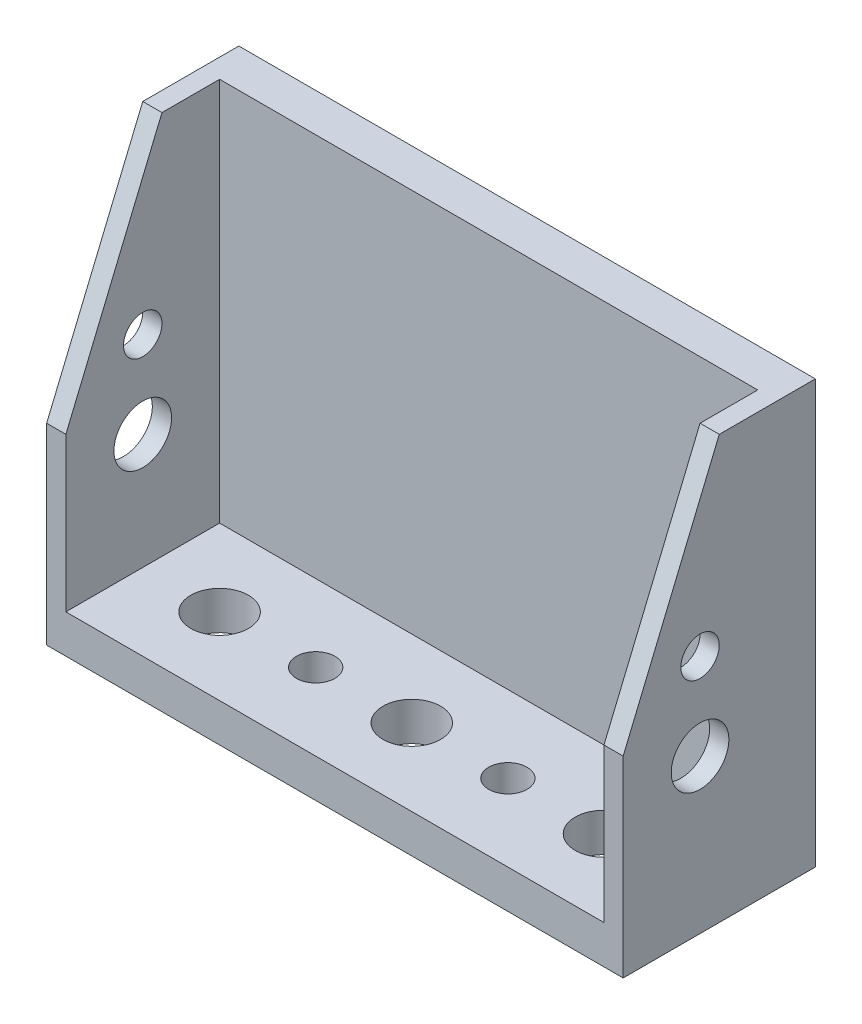
ISO-10303-21;
HEADER;
FILE_DESCRIPTION(('STEP AP214'),'2;1');
FILE_NAME('part.step','',(''),(''),'','','');
FILE_SCHEMA(('AUTOMOTIVE_DESIGN { 1 0 10303 214 1 1 1 1 }'));
ENDSEC;
DATA;
#1=APPLICATION_CONTEXT('core data for automotive mechanical design processes');
#2=APPLICATION_PROTOCOL_DEFINITION('international standard','automotive_design',2000,#1);
#3=PRODUCT_CONTEXT('',#1,'mechanical');
#4=PRODUCT('Part','Part','',(#3));
#5=PRODUCT_RELATED_PRODUCT_CATEGORY('part','',(#4));
#6=PRODUCT_DEFINITION_FORMATION('','',#4);
#7=PRODUCT_DEFINITION_CONTEXT('part definition',#1,'design');
#8=PRODUCT_DEFINITION('design','',#6,#7);
#9=PRODUCT_DEFINITION_SHAPE('','',#8);
#10=(LENGTH_UNIT() NAMED_UNIT(*) SI_UNIT(.MILLI.,.METRE.));
#11=(NAMED_UNIT(*) PLANE_ANGLE_UNIT() SI_UNIT($,.RADIAN.));
#12=(NAMED_UNIT(*) SI_UNIT($,.STERADIAN.) SOLID_ANGLE_UNIT());
#13=UNCERTAINTY_MEASURE_WITH_UNIT(LENGTH_MEASURE(1.E-05),#10,'distance_accuracy_value','');
#14=(GEOMETRIC_REPRESENTATION_CONTEXT(3) GLOBAL_UNCERTAINTY_ASSIGNED_CONTEXT((#13)) GLOBAL_UNIT_ASSIGNED_CONTEXT((#10,
#11,#12)) REPRESENTATION_CONTEXT('',''));
#15=CARTESIAN_POINT('',(0.,0.,0.));
#16=DIRECTION('',(0.,0.,1.));
#17=DIRECTION('',(1.,0.,0.));
#18=AXIS2_PLACEMENT_3D('',#15,#16,#17);
#19=CARTESIAN_POINT('',(0.,2.,0.));
#20=DIRECTION('',(0.,-1.,0.));
#21=DIRECTION('',(0.,0.,-1.));
#22=AXIS2_PLACEMENT_3D('',#19,#20,#21);
#23=PLANE('',#22);
#24=CARTESIAN_POINT('',(5.,2.,0.999999999999999));
#25=DIRECTION('',(0.,-1.,0.));
#26=DIRECTION('',(0.,0.,-1.));
#27=AXIS2_PLACEMENT_3D('',#24,#25,#26);
#28=CIRCLE('',#27,1.);
#29=CARTESIAN_POINT('',(5.,2.,0.));
#30=VERTEX_POINT('',#29);
#31=EDGE_CURVE('E246',#30,#30,#28,.T.);
#32=ORIENTED_EDGE('',*,*,#31,.T.);
#33=EDGE_LOOP('',(#32));
#34=FACE_BOUND('',#33,.T.);
#35=CARTESIAN_POINT('',(-5.,2.,0.999999999999999));
#36=DIRECTION('',(0.,-1.,0.));
#37=DIRECTION('',(0.,0.,-1.));
#38=AXIS2_PLACEMENT_3D('',#35,#36,#37);
#39=CIRCLE('',#38,1.);
#40=CARTESIAN_POINT('',(-5.,2.,0.));
#41=VERTEX_POINT('',#40);
#42=EDGE_CURVE('E243',#41,#41,#39,.T.);
#43=ORIENTED_EDGE('',*,*,#42,.T.);
#44=EDGE_LOOP('',(#43));
#45=FACE_BOUND('',#44,.T.);
#46=CARTESIAN_POINT('',(10.,2.,0.999999999999999));
#47=DIRECTION('',(0.,-1.,0.));
#48=DIRECTION('',(0.,0.,-1.));
#49=AXIS2_PLACEMENT_3D('',#46,#47,#48);
#50=CIRCLE('',#49,1.5);
#51=CARTESIAN_POINT('',(10.,2.,-0.5));
#52=VERTEX_POINT('',#51);
#53=EDGE_CURVE('E240',#52,#52,#50,.T.);
#54=ORIENTED_EDGE('',*,*,#53,.T.);
#55=EDGE_LOOP('',(#54));
#56=FACE_BOUND('',#55,.T.);
#57=CARTESIAN_POINT('',(-10.,2.,0.999999999999999));
#58=DIRECTION('',(0.,-1.,0.));
#59=DIRECTION('',(0.,0.,-1.));
#60=AXIS2_PLACEMENT_3D('',#57,#58,#59);
#61=CIRCLE('',#60,1.5);
#62=CARTESIAN_POINT('',(-10.,2.,-0.5));
#63=VERTEX_POINT('',#62);
#64=EDGE_CURVE('E237',#63,#63,#61,.T.);
#65=ORIENTED_EDGE('',*,*,#64,.T.);
#66=EDGE_LOOP('',(#65));
#67=FACE_BOUND('',#66,.T.);
#68=CARTESIAN_POINT('',(0.,2.,0.999999999999999));
#69=DIRECTION('',(0.,-1.,0.));
#70=DIRECTION('',(0.,0.,-1.));
#71=AXIS2_PLACEMENT_3D('',#68,#69,#70);
#72=CIRCLE('',#71,1.5);
#73=CARTESIAN_POINT('',(0.,2.,-0.500000000000001));
#74=VERTEX_POINT('',#73);
#75=EDGE_CURVE('E234',#74,#74,#72,.T.);
#76=ORIENTED_EDGE('',*,*,#75,.T.);
#77=EDGE_LOOP('',(#76));
#78=FACE_BOUND('',#77,.T.);
#79=DIRECTION('',(1.,0.,0.));
#80=VECTOR('',#79,1.);
#81=CARTESIAN_POINT('',(-15.,2.,-3.));
#82=LINE('',#81,#80);
#83=CARTESIAN_POINT('',(-14.,2.,-3.));
#84=VERTEX_POINT('',#83);
#85=CARTESIAN_POINT('',(14.,2.,-3.));
#86=VERTEX_POINT('',#85);
#87=EDGE_CURVE('E166',#84,#86,#82,.T.);
#88=ORIENTED_EDGE('',*,*,#87,.F.);
#89=DIRECTION('',(0.,0.,-1.));
#90=VECTOR('',#89,1.);
#91=CARTESIAN_POINT('',(-14.,2.,5.));
#92=LINE('',#91,#90);
#93=CARTESIAN_POINT('',(-14.,2.,5.));
#94=VERTEX_POINT('',#93);
#95=EDGE_CURVE('E129',#94,#84,#92,.T.);
#96=ORIENTED_EDGE('',*,*,#95,.F.);
#97=DIRECTION('',(1.,0.,0.));
#98=VECTOR('',#97,1.);
#99=CARTESIAN_POINT('',(-15.,2.,5.));
#100=LINE('',#99,#98);
#101=CARTESIAN_POINT('',(14.,2.,5.));
#102=VERTEX_POINT('',#101);
#103=EDGE_CURVE('E126',#94,#102,#100,.T.);
#104=ORIENTED_EDGE('',*,*,#103,.T.);
#105=DIRECTION('',(0.,0.,-1.));
#106=VECTOR('',#105,1.);
#107=CARTESIAN_POINT('',(14.,2.,-3.));
#108=LINE('',#107,#106);
#109=EDGE_CURVE('E144',#102,#86,#108,.T.);
#110=ORIENTED_EDGE('',*,*,#109,.T.);
#111=EDGE_LOOP('',(#88,#96,#104,#110));
#112=FACE_BOUND('',#111,.T.);
#113=ADVANCED_FACE('F40',(#34,#45,#56,#67,#78,#112),#23,.F.);
#114=CARTESIAN_POINT('',(15.,2.,5.));
#115=DIRECTION('',(-1.,0.,0.));
#116=DIRECTION('',(0.,0.,1.));
#117=AXIS2_PLACEMENT_3D('',#114,#115,#116);
#118=PLANE('',#117);
#119=CARTESIAN_POINT('',(15.,8.,0.999999999999999));
#120=DIRECTION('',(1.,0.,0.));
#121=DIRECTION('',(0.,0.,-1.));
#122=AXIS2_PLACEMENT_3D('',#119,#120,#121);
#123=CIRCLE('',#122,1.5);
#124=CARTESIAN_POINT('',(15.,8.,-0.500000000000001));
#125=VERTEX_POINT('',#124);
#126=EDGE_CURVE('E197',#125,#125,#123,.T.);
#127=ORIENTED_EDGE('',*,*,#126,.F.);
#128=EDGE_LOOP('',(#127));
#129=FACE_BOUND('',#128,.T.);
#130=CARTESIAN_POINT('',(15.,12.5,0.999999999999999));
#131=DIRECTION('',(1.,0.,0.));
#132=DIRECTION('',(0.,0.,-1.));
#133=AXIS2_PLACEMENT_3D('',#130,#131,#132);
#134=CIRCLE('',#133,1.);
#135=CARTESIAN_POINT('',(15.,12.5,0.));
#136=VERTEX_POINT('',#135);
#137=EDGE_CURVE('E204',#136,#136,#134,.T.);
#138=ORIENTED_EDGE('',*,*,#137,.F.);
#139=EDGE_LOOP('',(#138));
#140=FACE_BOUND('',#139,.T.);
#141=DIRECTION('',(0.,0.,-1.));
#142=VECTOR('',#141,1.);
#143=CARTESIAN_POINT('',(15.,0.,5.));
#144=LINE('',#143,#142);
#145=CARTESIAN_POINT('',(15.,0.,5.));
#146=VERTEX_POINT('',#145);
#147=CARTESIAN_POINT('',(15.,0.,-5.));
#148=VERTEX_POINT('',#147);
#149=EDGE_CURVE('E179',#146,#148,#144,.T.);
#150=ORIENTED_EDGE('',*,*,#149,.T.);
#151=DIRECTION('',(0.,-1.,0.));
#152=VECTOR('',#151,1.);
#153=CARTESIAN_POINT('',(15.,2.,-5.));
#154=LINE('',#153,#152);
#155=CARTESIAN_POINT('',(15.,22.,-5.));
#156=VERTEX_POINT('',#155);
#157=EDGE_CURVE('E11',#156,#148,#154,.T.);
#158=ORIENTED_EDGE('',*,*,#157,.F.);
#159=DIRECTION('',(0.,0.,-1.));
#160=VECTOR('',#159,1.);
#161=CARTESIAN_POINT('',(15.,22.,-5.));
#162=LINE('',#161,#160);
#163=CARTESIAN_POINT('',(15.,22.,0.));
#164=VERTEX_POINT('',#163);
#165=EDGE_CURVE('E173',#164,#156,#162,.T.);
#166=ORIENTED_EDGE('',*,*,#165,.F.);
#167=DIRECTION('',(0.,-0.923076923076923,0.384615384615385));
#168=VECTOR('',#167,1.);
#169=CARTESIAN_POINT('',(15.,10.,5.));
#170=LINE('',#169,#168);
#171=CARTESIAN_POINT('',(15.,10.,5.));
#172=VERTEX_POINT('',#171);
#173=EDGE_CURVE('E140',#164,#172,#170,.T.);
#174=ORIENTED_EDGE('',*,*,#173,.T.);
#175=DIRECTION('',(0.,-1.,0.));
#176=VECTOR('',#175,1.);
#177=CARTESIAN_POINT('',(15.,2.,5.));
#178=LINE('',#177,#176);
#179=EDGE_CURVE('E182',#172,#146,#178,.T.);
#180=ORIENTED_EDGE('',*,*,#179,.T.);
#181=EDGE_LOOP('',(#150,#158,#166,#174,#180));
#182=FACE_BOUND('',#181,.T.);
#183=ADVANCED_FACE('F42',(#129,#140,#182),#118,.F.);
#184=CARTESIAN_POINT('',(-15.,2.,-5.));
#185=DIRECTION('',(0.,0.,1.));
#186=DIRECTION('',(1.,0.,0.));
#187=AXIS2_PLACEMENT_3D('',#184,#185,#186);
#188=PLANE('',#187);
#189=DIRECTION('',(-1.,0.,0.));
#190=VECTOR('',#189,1.);
#191=CARTESIAN_POINT('',(-15.,0.,-5.));
#192=LINE('',#191,#190);
#193=CARTESIAN_POINT('',(-15.,0.,-5.));
#194=VERTEX_POINT('',#193);
#195=EDGE_CURVE('E185',#148,#194,#192,.T.);
#196=ORIENTED_EDGE('',*,*,#195,.T.);
#197=DIRECTION('',(0.,-1.,0.));
#198=VECTOR('',#197,1.);
#199=CARTESIAN_POINT('',(-15.,2.,-5.));
#200=LINE('',#199,#198);
#201=CARTESIAN_POINT('',(-15.,22.,-5.));
#202=VERTEX_POINT('',#201);
#203=EDGE_CURVE('E49',#202,#194,#200,.T.);
#204=ORIENTED_EDGE('',*,*,#203,.F.);
#205=DIRECTION('',(-1.,0.,0.));
#206=VECTOR('',#205,1.);
#207=CARTESIAN_POINT('',(-15.,22.,-5.));
#208=LINE('',#207,#206);
#209=EDGE_CURVE('E176',#156,#202,#208,.T.);
#210=ORIENTED_EDGE('',*,*,#209,.F.);
#211=ORIENTED_EDGE('',*,*,#157,.T.);
#212=EDGE_LOOP('',(#196,#204,#210,#211));
#213=FACE_BOUND('',#212,.T.);
#214=ADVANCED_FACE('F272',(#213),#188,.F.);
#215=CARTESIAN_POINT('',(-15.,2.,5.));
#216=DIRECTION('',(1.,0.,0.));
#217=DIRECTION('',(0.,0.,-1.));
#218=AXIS2_PLACEMENT_3D('',#215,#216,#217);
#219=PLANE('',#218);
#220=CARTESIAN_POINT('',(-15.,8.,0.999999999999999));
#221=DIRECTION('',(1.,0.,0.));
#222=DIRECTION('',(0.,0.,-1.));
#223=AXIS2_PLACEMENT_3D('',#220,#221,#222);
#224=CIRCLE('',#223,1.5);
#225=CARTESIAN_POINT('',(-15.,8.,-0.500000000000001));
#226=VERTEX_POINT('',#225);
#227=EDGE_CURVE('E216',#226,#226,#224,.T.);
#228=ORIENTED_EDGE('',*,*,#227,.T.);
#229=EDGE_LOOP('',(#228));
#230=FACE_BOUND('',#229,.T.);
#231=CARTESIAN_POINT('',(-15.,12.5,0.999999999999999));
#232=DIRECTION('',(1.,0.,0.));
#233=DIRECTION('',(0.,0.,-1.));
#234=AXIS2_PLACEMENT_3D('',#231,#232,#233);
#235=CIRCLE('',#234,1.);
#236=CARTESIAN_POINT('',(-15.,12.5,0.));
#237=VERTEX_POINT('',#236);
#238=EDGE_CURVE('E201',#237,#237,#235,.T.);
#239=ORIENTED_EDGE('',*,*,#238,.T.);
#240=EDGE_LOOP('',(#239));
#241=FACE_BOUND('',#240,.T.);
#242=DIRECTION('',(0.,-1.,0.));
#243=VECTOR('',#242,1.);
#244=CARTESIAN_POINT('',(-15.,2.,5.));
#245=LINE('',#244,#243);
#246=CARTESIAN_POINT('',(-15.,10.,5.));
#247=VERTEX_POINT('',#246);
#248=CARTESIAN_POINT('',(-15.,0.,5.));
#249=VERTEX_POINT('',#248);
#250=EDGE_CURVE('E191',#247,#249,#245,.T.);
#251=ORIENTED_EDGE('',*,*,#250,.F.);
#252=DIRECTION('',(0.,-0.923076923076923,0.384615384615385));
#253=VECTOR('',#252,1.);
#254=CARTESIAN_POINT('',(-15.,3.18343195266272,7.84023668639053));
#255=LINE('',#254,#253);
#256=CARTESIAN_POINT('',(-15.,22.,0.));
#257=VERTEX_POINT('',#256);
#258=EDGE_CURVE('E136',#257,#247,#255,.T.);
#259=ORIENTED_EDGE('',*,*,#258,.F.);
#260=DIRECTION('',(0.,0.,1.));
#261=VECTOR('',#260,1.);
#262=CARTESIAN_POINT('',(-15.,22.,-5.));
#263=LINE('',#262,#261);
#264=EDGE_CURVE('E169',#202,#257,#263,.T.);
#265=ORIENTED_EDGE('',*,*,#264,.F.);
#266=ORIENTED_EDGE('',*,*,#203,.T.);
#267=DIRECTION('',(0.,0.,1.));
#268=VECTOR('',#267,1.);
#269=CARTESIAN_POINT('',(-15.,0.,5.));
#270=LINE('',#269,#268);
#271=EDGE_CURVE('E187',#194,#249,#270,.T.);
#272=ORIENTED_EDGE('',*,*,#271,.T.);
#273=EDGE_LOOP('',(#251,#259,#265,#266,#272));
#274=FACE_BOUND('',#273,.T.);
#275=ADVANCED_FACE('F275',(#230,#241,#274),#219,.F.);
#276=CARTESIAN_POINT('',(-15.,2.,5.));
#277=DIRECTION('',(0.,0.,-1.));
#278=DIRECTION('',(-1.,0.,0.));
#279=AXIS2_PLACEMENT_3D('',#276,#277,#278);
#280=PLANE('',#279);
#281=DIRECTION('',(1.,0.,0.));
#282=VECTOR('',#281,1.);
#283=CARTESIAN_POINT('',(-15.,0.,5.));
#284=LINE('',#283,#282);
#285=EDGE_CURVE('E65',#249,#146,#284,.T.);
#286=ORIENTED_EDGE('',*,*,#285,.T.);
#287=ORIENTED_EDGE('',*,*,#179,.F.);
#288=DIRECTION('',(1.,0.,0.));
#289=VECTOR('',#288,1.);
#290=CARTESIAN_POINT('',(14.,10.,5.));
#291=LINE('',#290,#289);
#292=CARTESIAN_POINT('',(14.,10.,5.));
#293=VERTEX_POINT('',#292);
#294=EDGE_CURVE('E163',#293,#172,#291,.T.);
#295=ORIENTED_EDGE('',*,*,#294,.F.);
#296=DIRECTION('',(0.,-1.,0.));
#297=VECTOR('',#296,1.);
#298=CARTESIAN_POINT('',(14.,2.,5.));
#299=LINE('',#298,#297);
#300=EDGE_CURVE('E160',#293,#102,#299,.T.);
#301=ORIENTED_EDGE('',*,*,#300,.T.);
#302=ORIENTED_EDGE('',*,*,#103,.F.);
#303=DIRECTION('',(0.,-1.,0.));
#304=VECTOR('',#303,1.);
#305=CARTESIAN_POINT('',(-14.,2.,5.));
#306=LINE('',#305,#304);
#307=CARTESIAN_POINT('',(-14.,10.,5.));
#308=VERTEX_POINT('',#307);
#309=EDGE_CURVE('E119',#308,#94,#306,.T.);
#310=ORIENTED_EDGE('',*,*,#309,.F.);
#311=DIRECTION('',(-1.,0.,0.));
#312=VECTOR('',#311,1.);
#313=CARTESIAN_POINT('',(-14.,10.,5.));
#314=LINE('',#313,#312);
#315=EDGE_CURVE('E123',#308,#247,#314,.T.);
#316=ORIENTED_EDGE('',*,*,#315,.T.);
#317=ORIENTED_EDGE('',*,*,#250,.T.);
#318=EDGE_LOOP('',(#286,#287,#295,#301,#302,#310,#316,#317));
#319=FACE_BOUND('',#318,.T.);
#320=ADVANCED_FACE('F121',(#319),#280,.F.);
#321=CARTESIAN_POINT('',(0.,0.,0.));
#322=DIRECTION('',(0.,-1.,0.));
#323=DIRECTION('',(0.,0.,-1.));
#324=AXIS2_PLACEMENT_3D('',#321,#322,#323);
#325=PLANE('',#324);
#326=CARTESIAN_POINT('',(5.,0.,0.999999999999999));
#327=DIRECTION('',(0.,-1.,0.));
#328=DIRECTION('',(0.,0.,-1.));
#329=AXIS2_PLACEMENT_3D('',#326,#327,#328);
#330=CIRCLE('',#329,1.);
#331=CARTESIAN_POINT('',(5.,0.,0.));
#332=VERTEX_POINT('',#331);
#333=EDGE_CURVE('E226',#332,#332,#330,.T.);
#334=ORIENTED_EDGE('',*,*,#333,.F.);
#335=EDGE_LOOP('',(#334));
#336=FACE_BOUND('',#335,.T.);
#337=CARTESIAN_POINT('',(-5.,0.,0.999999999999999));
#338=DIRECTION('',(0.,-1.,0.));
#339=DIRECTION('',(0.,0.,-1.));
#340=AXIS2_PLACEMENT_3D('',#337,#338,#339);
#341=CIRCLE('',#340,1.);
#342=CARTESIAN_POINT('',(-5.,0.,0.));
#343=VERTEX_POINT('',#342);
#344=EDGE_CURVE('E223',#343,#343,#341,.T.);
#345=ORIENTED_EDGE('',*,*,#344,.F.);
#346=EDGE_LOOP('',(#345));
#347=FACE_BOUND('',#346,.T.);
#348=CARTESIAN_POINT('',(10.,0.,0.999999999999999));
#349=DIRECTION('',(0.,-1.,0.));
#350=DIRECTION('',(0.,0.,-1.));
#351=AXIS2_PLACEMENT_3D('',#348,#349,#350);
#352=CIRCLE('',#351,1.5);
#353=CARTESIAN_POINT('',(10.,0.,-0.5));
#354=VERTEX_POINT('',#353);
#355=EDGE_CURVE('E220',#354,#354,#352,.T.);
#356=ORIENTED_EDGE('',*,*,#355,.F.);
#357=EDGE_LOOP('',(#356));
#358=FACE_BOUND('',#357,.T.);
#359=CARTESIAN_POINT('',(-10.,0.,0.999999999999999));
#360=DIRECTION('',(0.,-1.,0.));
#361=DIRECTION('',(0.,0.,-1.));
#362=AXIS2_PLACEMENT_3D('',#359,#360,#361);
#363=CIRCLE('',#362,1.5);
#364=CARTESIAN_POINT('',(-10.,0.,-0.5));
#365=VERTEX_POINT('',#364);
#366=EDGE_CURVE('E219',#365,#365,#363,.T.);
#367=ORIENTED_EDGE('',*,*,#366,.F.);
#368=EDGE_LOOP('',(#367));
#369=FACE_BOUND('',#368,.T.);
#370=CARTESIAN_POINT('',(0.,0.,0.999999999999999));
#371=DIRECTION('',(0.,-1.,0.));
#372=DIRECTION('',(0.,0.,-1.));
#373=AXIS2_PLACEMENT_3D('',#370,#371,#372);
#374=CIRCLE('',#373,1.5);
#375=CARTESIAN_POINT('',(0.,0.,-0.500000000000001));
#376=VERTEX_POINT('',#375);
#377=EDGE_CURVE('E229',#376,#376,#374,.T.);
#378=ORIENTED_EDGE('',*,*,#377,.F.);
#379=EDGE_LOOP('',(#378));
#380=FACE_BOUND('',#379,.T.);
#381=ORIENTED_EDGE('',*,*,#149,.F.);
#382=ORIENTED_EDGE('',*,*,#285,.F.);
#383=ORIENTED_EDGE('',*,*,#271,.F.);
#384=ORIENTED_EDGE('',*,*,#195,.F.);
#385=EDGE_LOOP('',(#381,#382,#383,#384));
#386=FACE_BOUND('',#385,.T.);
#387=ADVANCED_FACE('F278',(#336,#347,#358,#369,#380,#386),#325,.T.);
#388=CARTESIAN_POINT('',(-15.,22.,-3.));
#389=DIRECTION('',(0.,0.,-1.));
#390=DIRECTION('',(-1.,0.,0.));
#391=AXIS2_PLACEMENT_3D('',#388,#389,#390);
#392=PLANE('',#391);
#393=DIRECTION('',(1.,0.,0.));
#394=VECTOR('',#393,1.);
#395=CARTESIAN_POINT('',(-15.,22.,-3.));
#396=LINE('',#395,#394);
#397=CARTESIAN_POINT('',(-14.,22.,-3.));
#398=VERTEX_POINT('',#397);
#399=CARTESIAN_POINT('',(14.,22.,-3.));
#400=VERTEX_POINT('',#399);
#401=EDGE_CURVE('E171',#398,#400,#396,.T.);
#402=ORIENTED_EDGE('',*,*,#401,.F.);
#403=DIRECTION('',(0.,1.,0.));
#404=VECTOR('',#403,1.);
#405=CARTESIAN_POINT('',(-14.,2.,-3.));
#406=LINE('',#405,#404);
#407=EDGE_CURVE('E250',#84,#398,#406,.T.);
#408=ORIENTED_EDGE('',*,*,#407,.F.);
#409=ORIENTED_EDGE('',*,*,#87,.T.);
#410=DIRECTION('',(0.,1.,0.));
#411=VECTOR('',#410,1.);
#412=CARTESIAN_POINT('',(14.,22.,-3.));
#413=LINE('',#412,#411);
#414=EDGE_CURVE('E151',#86,#400,#413,.T.);
#415=ORIENTED_EDGE('',*,*,#414,.T.);
#416=EDGE_LOOP('',(#402,#408,#409,#415));
#417=FACE_BOUND('',#416,.T.);
#418=ADVANCED_FACE('F256',(#417),#392,.F.);
#419=CARTESIAN_POINT('',(0.,22.,0.));
#420=DIRECTION('',(0.,1.,0.));
#421=DIRECTION('',(0.,0.,1.));
#422=AXIS2_PLACEMENT_3D('',#419,#420,#421);
#423=PLANE('',#422);
#424=ORIENTED_EDGE('',*,*,#264,.T.);
#425=DIRECTION('',(-1.,0.,0.));
#426=VECTOR('',#425,1.);
#427=CARTESIAN_POINT('',(-14.,22.,0.));
#428=LINE('',#427,#426);
#429=CARTESIAN_POINT('',(-14.,22.,0.));
#430=VERTEX_POINT('',#429);
#431=EDGE_CURVE('E141',#430,#257,#428,.T.);
#432=ORIENTED_EDGE('',*,*,#431,.F.);
#433=DIRECTION('',(0.,0.,1.));
#434=VECTOR('',#433,1.);
#435=CARTESIAN_POINT('',(-14.,22.,5.));
#436=LINE('',#435,#434);
#437=EDGE_CURVE('E57',#398,#430,#436,.T.);
#438=ORIENTED_EDGE('',*,*,#437,.F.);
#439=ORIENTED_EDGE('',*,*,#401,.T.);
#440=DIRECTION('',(0.,0.,1.));
#441=VECTOR('',#440,1.);
#442=CARTESIAN_POINT('',(14.,22.,0.));
#443=LINE('',#442,#441);
#444=CARTESIAN_POINT('',(14.,22.,0.));
#445=VERTEX_POINT('',#444);
#446=EDGE_CURVE('E154',#400,#445,#443,.T.);
#447=ORIENTED_EDGE('',*,*,#446,.T.);
#448=DIRECTION('',(1.,0.,0.));
#449=VECTOR('',#448,1.);
#450=CARTESIAN_POINT('',(14.,22.,0.));
#451=LINE('',#450,#449);
#452=EDGE_CURVE('E161',#445,#164,#451,.T.);
#453=ORIENTED_EDGE('',*,*,#452,.T.);
#454=ORIENTED_EDGE('',*,*,#165,.T.);
#455=ORIENTED_EDGE('',*,*,#209,.T.);
#456=EDGE_LOOP('',(#424,#432,#438,#439,#447,#453,#454,#455));
#457=FACE_BOUND('',#456,.T.);
#458=ADVANCED_FACE('F259',(#457),#423,.T.);
#459=CARTESIAN_POINT('',(14.,10.,5.));
#460=DIRECTION('',(0.,0.384615384615385,0.923076923076923));
#461=DIRECTION('',(0.,-0.923076923076923,0.384615384615385));
#462=AXIS2_PLACEMENT_3D('',#459,#460,#461);
#463=PLANE('',#462);
#464=ORIENTED_EDGE('',*,*,#173,.F.);
#465=ORIENTED_EDGE('',*,*,#452,.F.);
#466=DIRECTION('',(0.,-0.923076923076923,0.384615384615385));
#467=VECTOR('',#466,1.);
#468=CARTESIAN_POINT('',(14.,10.,5.));
#469=LINE('',#468,#467);
#470=EDGE_CURVE('E157',#445,#293,#469,.T.);
#471=ORIENTED_EDGE('',*,*,#470,.T.);
#472=ORIENTED_EDGE('',*,*,#294,.T.);
#473=EDGE_LOOP('',(#464,#465,#471,#472));
#474=FACE_BOUND('',#473,.T.);
#475=ADVANCED_FACE('F267',(#474),#463,.T.);
#476=CARTESIAN_POINT('',(14.,0.,0.));
#477=DIRECTION('',(-1.,0.,0.));
#478=DIRECTION('',(0.,0.,1.));
#479=AXIS2_PLACEMENT_3D('',#476,#477,#478);
#480=PLANE('',#479);
#481=CARTESIAN_POINT('',(14.,8.,0.999999999999999));
#482=DIRECTION('',(-1.,0.,0.));
#483=DIRECTION('',(0.,0.,1.));
#484=AXIS2_PLACEMENT_3D('',#481,#482,#483);
#485=CIRCLE('',#484,1.5);
#486=CARTESIAN_POINT('',(14.,8.,2.5));
#487=VERTEX_POINT('',#486);
#488=EDGE_CURVE('E213',#487,#487,#485,.T.);
#489=ORIENTED_EDGE('',*,*,#488,.F.);
#490=EDGE_LOOP('',(#489));
#491=FACE_BOUND('',#490,.T.);
#492=CARTESIAN_POINT('',(14.,12.5,0.999999999999999));
#493=DIRECTION('',(-1.,0.,0.));
#494=DIRECTION('',(0.,0.,1.));
#495=AXIS2_PLACEMENT_3D('',#492,#493,#494);
#496=CIRCLE('',#495,1.);
#497=CARTESIAN_POINT('',(14.,12.5,2.));
#498=VERTEX_POINT('',#497);
#499=EDGE_CURVE('E196',#498,#498,#496,.T.);
#500=ORIENTED_EDGE('',*,*,#499,.F.);
#501=EDGE_LOOP('',(#500));
#502=FACE_BOUND('',#501,.T.);
#503=ORIENTED_EDGE('',*,*,#109,.F.);
#504=ORIENTED_EDGE('',*,*,#300,.F.);
#505=ORIENTED_EDGE('',*,*,#470,.F.);
#506=ORIENTED_EDGE('',*,*,#446,.F.);
#507=ORIENTED_EDGE('',*,*,#414,.F.);
#508=EDGE_LOOP('',(#503,#504,#505,#506,#507));
#509=FACE_BOUND('',#508,.T.);
#510=ADVANCED_FACE('F263',(#491,#502,#509),#480,.T.);
#511=CARTESIAN_POINT('',(-14.,3.18343195266272,7.84023668639053));
#512=DIRECTION('',(0.,-0.384615384615385,-0.923076923076923));
#513=DIRECTION('',(0.,0.923076923076923,-0.384615384615385));
#514=AXIS2_PLACEMENT_3D('',#511,#512,#513);
#515=PLANE('',#514);
#516=ORIENTED_EDGE('',*,*,#258,.T.);
#517=ORIENTED_EDGE('',*,*,#315,.F.);
#518=DIRECTION('',(0.,-0.923076923076923,0.384615384615385));
#519=VECTOR('',#518,1.);
#520=CARTESIAN_POINT('',(-14.,3.18343195266272,7.84023668639053));
#521=LINE('',#520,#519);
#522=EDGE_CURVE('E130',#430,#308,#521,.T.);
#523=ORIENTED_EDGE('',*,*,#522,.F.);
#524=ORIENTED_EDGE('',*,*,#431,.T.);
#525=EDGE_LOOP('',(#516,#517,#523,#524));
#526=FACE_BOUND('',#525,.T.);
#527=ADVANCED_FACE('F138',(#526),#515,.F.);
#528=CARTESIAN_POINT('',(-14.,0.,0.));
#529=DIRECTION('',(1.,0.,0.));
#530=DIRECTION('',(0.,0.,-1.));
#531=AXIS2_PLACEMENT_3D('',#528,#529,#530);
#532=PLANE('',#531);
#533=CARTESIAN_POINT('',(-14.,8.,0.999999999999999));
#534=DIRECTION('',(1.,0.,0.));
#535=DIRECTION('',(0.,0.,-1.));
#536=AXIS2_PLACEMENT_3D('',#533,#534,#535);
#537=CIRCLE('',#536,1.5);
#538=CARTESIAN_POINT('',(-14.,8.,-0.500000000000001));
#539=VERTEX_POINT('',#538);
#540=EDGE_CURVE('E44',#539,#539,#537,.T.);
#541=ORIENTED_EDGE('',*,*,#540,.F.);
#542=EDGE_LOOP('',(#541));
#543=FACE_BOUND('',#542,.T.);
#544=CARTESIAN_POINT('',(-14.,12.5,0.999999999999999));
#545=DIRECTION('',(1.,0.,0.));
#546=DIRECTION('',(0.,0.,-1.));
#547=AXIS2_PLACEMENT_3D('',#544,#545,#546);
#548=CIRCLE('',#547,1.);
#549=CARTESIAN_POINT('',(-14.,12.5,0.));
#550=VERTEX_POINT('',#549);
#551=EDGE_CURVE('E194',#550,#550,#548,.T.);
#552=ORIENTED_EDGE('',*,*,#551,.F.);
#553=EDGE_LOOP('',(#552));
#554=FACE_BOUND('',#553,.T.);
#555=ORIENTED_EDGE('',*,*,#522,.T.);
#556=ORIENTED_EDGE('',*,*,#309,.T.);
#557=ORIENTED_EDGE('',*,*,#95,.T.);
#558=ORIENTED_EDGE('',*,*,#407,.T.);
#559=ORIENTED_EDGE('',*,*,#437,.T.);
#560=EDGE_LOOP('',(#555,#556,#557,#558,#559));
#561=FACE_BOUND('',#560,.T.);
#562=ADVANCED_FACE('F133',(#543,#554,#561),#532,.T.);
#563=CARTESIAN_POINT('',(0.,11.,0.999999999999999));
#564=DIRECTION('',(0.,-1.,0.));
#565=DIRECTION('',(0.,0.,-1.));
#566=AXIS2_PLACEMENT_3D('',#563,#564,#565);
#567=CYLINDRICAL_SURFACE('',#566,1.5);
#568=ORIENTED_EDGE('',*,*,#377,.T.);
#569=EDGE_LOOP('',(#568));
#570=FACE_BOUND('',#569,.T.);
#571=ORIENTED_EDGE('',*,*,#75,.F.);
#572=EDGE_LOOP('',(#571));
#573=FACE_BOUND('',#572,.T.);
#574=ADVANCED_FACE('F340',(#570,#573),#567,.F.);
#575=CARTESIAN_POINT('',(-10.,11.,0.999999999999999));
#576=DIRECTION('',(0.,-1.,0.));
#577=DIRECTION('',(0.,0.,-1.));
#578=AXIS2_PLACEMENT_3D('',#575,#576,#577);
#579=CYLINDRICAL_SURFACE('',#578,1.5);
#580=ORIENTED_EDGE('',*,*,#366,.T.);
#581=EDGE_LOOP('',(#580));
#582=FACE_BOUND('',#581,.T.);
#583=ORIENTED_EDGE('',*,*,#64,.F.);
#584=EDGE_LOOP('',(#583));
#585=FACE_BOUND('',#584,.T.);
#586=ADVANCED_FACE('F344',(#582,#585),#579,.F.);
#587=CARTESIAN_POINT('',(10.,11.,0.999999999999999));
#588=DIRECTION('',(0.,-1.,0.));
#589=DIRECTION('',(0.,0.,-1.));
#590=AXIS2_PLACEMENT_3D('',#587,#588,#589);
#591=CYLINDRICAL_SURFACE('',#590,1.5);
#592=ORIENTED_EDGE('',*,*,#355,.T.);
#593=EDGE_LOOP('',(#592));
#594=FACE_BOUND('',#593,.T.);
#595=ORIENTED_EDGE('',*,*,#53,.F.);
#596=EDGE_LOOP('',(#595));
#597=FACE_BOUND('',#596,.T.);
#598=ADVANCED_FACE('F347',(#594,#597),#591,.F.);
#599=CARTESIAN_POINT('',(-5.,11.,0.999999999999999));
#600=DIRECTION('',(0.,-1.,0.));
#601=DIRECTION('',(0.,0.,-1.));
#602=AXIS2_PLACEMENT_3D('',#599,#600,#601);
#603=CYLINDRICAL_SURFACE('',#602,1.);
#604=ORIENTED_EDGE('',*,*,#344,.T.);
#605=EDGE_LOOP('',(#604));
#606=FACE_BOUND('',#605,.T.);
#607=ORIENTED_EDGE('',*,*,#42,.F.);
#608=EDGE_LOOP('',(#607));
#609=FACE_BOUND('',#608,.T.);
#610=ADVANCED_FACE('F310',(#606,#609),#603,.F.);
#611=CARTESIAN_POINT('',(5.,11.,0.999999999999999));
#612=DIRECTION('',(0.,-1.,0.));
#613=DIRECTION('',(0.,0.,-1.));
#614=AXIS2_PLACEMENT_3D('',#611,#612,#613);
#615=CYLINDRICAL_SURFACE('',#614,1.);
#616=ORIENTED_EDGE('',*,*,#333,.T.);
#617=EDGE_LOOP('',(#616));
#618=FACE_BOUND('',#617,.T.);
#619=ORIENTED_EDGE('',*,*,#31,.F.);
#620=EDGE_LOOP('',(#619));
#621=FACE_BOUND('',#620,.T.);
#622=ADVANCED_FACE('F306',(#618,#621),#615,.F.);
#623=CARTESIAN_POINT('',(-26.,12.5,0.999999999999999));
#624=DIRECTION('',(1.,0.,0.));
#625=DIRECTION('',(0.,0.,-1.));
#626=AXIS2_PLACEMENT_3D('',#623,#624,#625);
#627=CYLINDRICAL_SURFACE('',#626,1.);
#628=ORIENTED_EDGE('',*,*,#551,.T.);
#629=EDGE_LOOP('',(#628));
#630=FACE_BOUND('',#629,.T.);
#631=ORIENTED_EDGE('',*,*,#238,.F.);
#632=EDGE_LOOP('',(#631));
#633=FACE_BOUND('',#632,.T.);
#634=ADVANCED_FACE('F296',(#630,#633),#627,.F.);
#635=CARTESIAN_POINT('',(-26.,8.,0.999999999999999));
#636=DIRECTION('',(1.,0.,0.));
#637=DIRECTION('',(0.,0.,-1.));
#638=AXIS2_PLACEMENT_3D('',#635,#636,#637);
#639=CYLINDRICAL_SURFACE('',#638,1.5);
#640=ORIENTED_EDGE('',*,*,#540,.T.);
#641=EDGE_LOOP('',(#640));
#642=FACE_BOUND('',#641,.T.);
#643=ORIENTED_EDGE('',*,*,#227,.F.);
#644=EDGE_LOOP('',(#643));
#645=FACE_BOUND('',#644,.T.);
#646=ADVANCED_FACE('F293',(#642,#645),#639,.F.);
#647=ORIENTED_EDGE('',*,*,#499,.T.);
#648=EDGE_LOOP('',(#647));
#649=FACE_BOUND('',#648,.T.);
#650=ORIENTED_EDGE('',*,*,#137,.T.);
#651=EDGE_LOOP('',(#650));
#652=FACE_BOUND('',#651,.T.);
#653=ADVANCED_FACE('F290',(#649,#652),#627,.F.);
#654=ORIENTED_EDGE('',*,*,#488,.T.);
#655=EDGE_LOOP('',(#654));
#656=FACE_BOUND('',#655,.T.);
#657=ORIENTED_EDGE('',*,*,#126,.T.);
#658=EDGE_LOOP('',(#657));
#659=FACE_BOUND('',#658,.T.);
#660=ADVANCED_FACE('F292',(#656,#659),#639,.F.);
#661=CLOSED_SHELL('',(#113,#183,#214,#275,#320,#387,#418,#458,#475,#510,#527,#562,#574,#586,
#598,#610,#622,#634,#646,#653,#660));
#662=MANIFOLD_SOLID_BREP('B2',#661);
#663=ADVANCED_BREP_SHAPE_REPRESENTATION('',(#18,#662),#14);
#664=SHAPE_DEFINITION_REPRESENTATION(#9,#663);
ENDSEC;
END-ISO-10303-21;
